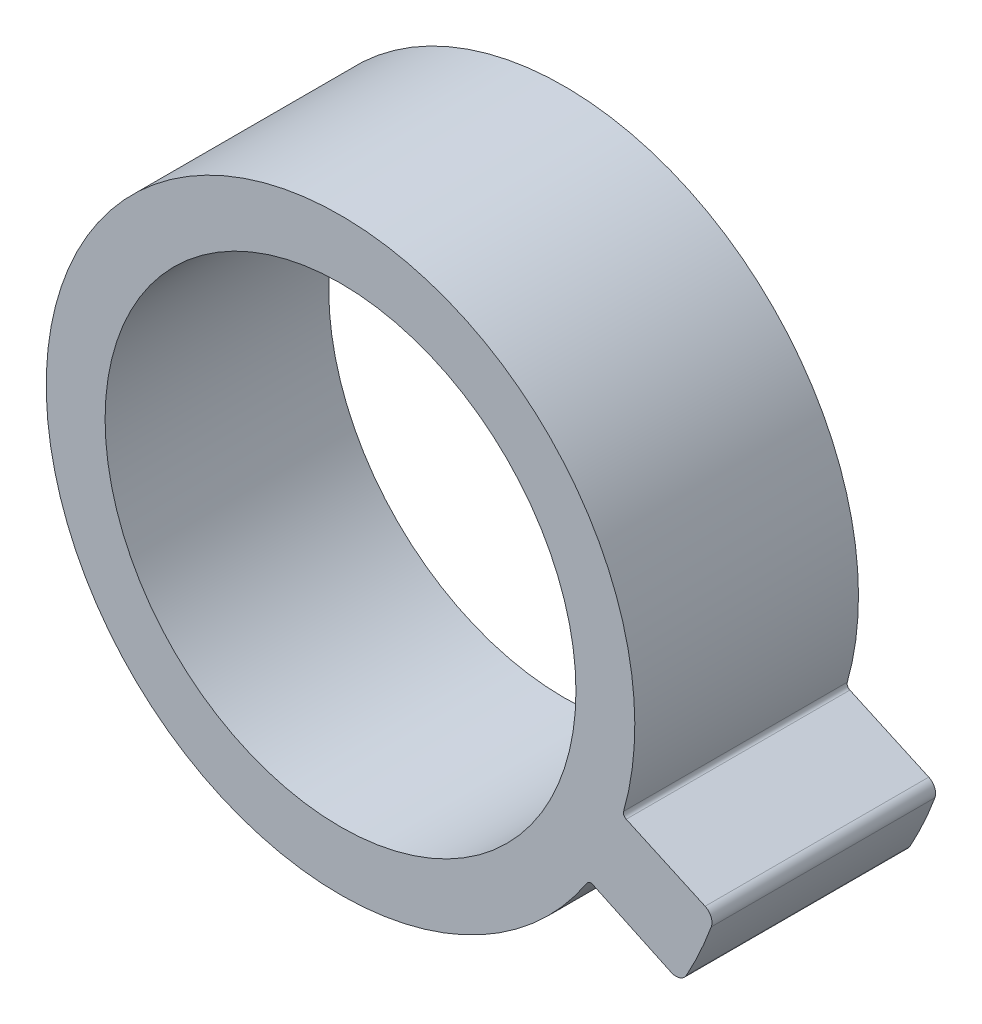
ISO-10303-21;
HEADER;
FILE_DESCRIPTION(('STEP AP214'),'2;1');
FILE_NAME('part.step','',(''),(''),'','','');
FILE_SCHEMA(('AUTOMOTIVE_DESIGN { 1 0 10303 214 1 1 1 1 }'));
ENDSEC;
DATA;
#1=APPLICATION_CONTEXT('core data for automotive mechanical design processes');
#2=APPLICATION_PROTOCOL_DEFINITION('international standard','automotive_design',2000,#1);
#3=PRODUCT_CONTEXT('',#1,'mechanical');
#4=PRODUCT('Part','Part','',(#3));
#5=PRODUCT_RELATED_PRODUCT_CATEGORY('part','',(#4));
#6=PRODUCT_DEFINITION_FORMATION('','',#4);
#7=PRODUCT_DEFINITION_CONTEXT('part definition',#1,'design');
#8=PRODUCT_DEFINITION('design','',#6,#7);
#9=PRODUCT_DEFINITION_SHAPE('','',#8);
#10=(LENGTH_UNIT() NAMED_UNIT(*) SI_UNIT(.MILLI.,.METRE.));
#11=(NAMED_UNIT(*) PLANE_ANGLE_UNIT() SI_UNIT($,.RADIAN.));
#12=(NAMED_UNIT(*) SI_UNIT($,.STERADIAN.) SOLID_ANGLE_UNIT());
#13=UNCERTAINTY_MEASURE_WITH_UNIT(LENGTH_MEASURE(1.E-05),#10,'distance_accuracy_value','');
#14=(GEOMETRIC_REPRESENTATION_CONTEXT(3) GLOBAL_UNCERTAINTY_ASSIGNED_CONTEXT((#13)) GLOBAL_UNIT_ASSIGNED_CONTEXT((#10,
#11,#12)) REPRESENTATION_CONTEXT('',''));
#15=CARTESIAN_POINT('',(0.,0.,0.));
#16=DIRECTION('',(0.,0.,1.));
#17=DIRECTION('',(1.,0.,0.));
#18=AXIS2_PLACEMENT_3D('',#15,#16,#17);
#19=CARTESIAN_POINT('',(15.2779729773756,-5.63171072795015,9.5));
#20=DIRECTION('',(0.,0.,1.));
#21=DIRECTION('',(1.,0.,0.));
#22=AXIS2_PLACEMENT_3D('',#19,#20,#21);
#23=PLANE('',#22);
#24=CARTESIAN_POINT('',(15.2779729773756,-5.63171072795015,9.5));
#25=DIRECTION('',(0.,0.,1.));
#26=DIRECTION('',(1.,0.,0.));
#27=AXIS2_PLACEMENT_3D('',#24,#25,#26);
#28=CIRCLE('',#27,0.499999999999998);
#29=CARTESIAN_POINT('',(15.747114806579,-5.80464407953859,9.5));
#30=VERTEX_POINT('',#29);
#31=CARTESIAN_POINT('',(15.4851855949086,-5.17666904729318,9.5));
#32=VERTEX_POINT('',#31);
#33=EDGE_CURVE('E145',#30,#32,#28,.T.);
#34=ORIENTED_EDGE('',*,*,#33,.T.);
#35=DIRECTION('',(-0.91008336131393,0.414425235066037,0.));
#36=VECTOR('',#35,1.);
#37=CARTESIAN_POINT('',(15.4851855949086,-5.17666904729318,9.5));
#38=LINE('',#37,#36);
#39=CARTESIAN_POINT('',(12.1342315429715,-3.65074298414162,9.5));
#40=VERTEX_POINT('',#39);
#41=EDGE_CURVE('E93',#32,#40,#38,.T.);
#42=ORIENTED_EDGE('',*,*,#41,.T.);
#43=CARTESIAN_POINT('',(12.2171165899847,-3.46872631187883,9.5));
#44=DIRECTION('',(0.,0.,-1.));
#45=DIRECTION('',(-1.,0.,0.));
#46=AXIS2_PLACEMENT_3D('',#43,#44,#45);
#47=CIRCLE('',#46,0.200000000000001);
#48=CARTESIAN_POINT('',(12.0247210531345,-3.41410070066815,9.5));
#49=VERTEX_POINT('',#48);
#50=EDGE_CURVE('E160',#40,#49,#47,.T.);
#51=ORIENTED_EDGE('',*,*,#50,.T.);
#52=CARTESIAN_POINT('',(0.,0.,9.5));
#53=DIRECTION('',(0.,0.,1.));
#54=DIRECTION('',(1.,0.,0.));
#55=AXIS2_PLACEMENT_3D('',#52,#53,#54);
#56=CIRCLE('',#55,12.5);
#57=CARTESIAN_POINT('',(10.4644302610838,-6.837082660822,9.5));
#58=VERTEX_POINT('',#57);
#59=EDGE_CURVE('E173',#49,#58,#56,.T.);
#60=ORIENTED_EDGE('',*,*,#59,.T.);
#61=CARTESIAN_POINT('',(10.6318611452612,-6.94647598339515,9.5));
#62=DIRECTION('',(0.,0.,-1.));
#63=DIRECTION('',(1.,0.,0.));
#64=AXIS2_PLACEMENT_3D('',#61,#62,#63);
#65=CIRCLE('',#64,0.2);
#66=CARTESIAN_POINT('',(10.7168303378893,-6.76542285223159,9.5));
#67=VERTEX_POINT('',#66);
#68=EDGE_CURVE('E112',#58,#67,#65,.T.);
#69=ORIENTED_EDGE('',*,*,#68,.T.);
#70=DIRECTION('',(0.905265655817804,-0.424845963140479,0.));
#71=VECTOR('',#70,1.);
#72=CARTESIAN_POINT('',(14.04074762561,-8.32535482626113,9.5));
#73=LINE('',#72,#71);
#74=CARTESIAN_POINT('',(14.04074762561,-8.32535482626113,9.5));
#75=VERTEX_POINT('',#74);
#76=EDGE_CURVE('E106',#67,#75,#73,.T.);
#77=ORIENTED_EDGE('',*,*,#76,.T.);
#78=CARTESIAN_POINT('',(14.2531706071803,-7.87272199835223,9.5));
#79=DIRECTION('',(0.,0.,1.));
#80=DIRECTION('',(1.,0.,0.));
#81=AXIS2_PLACEMENT_3D('',#78,#79,#80);
#82=CIRCLE('',#81,0.499999999999995);
#83=CARTESIAN_POINT('',(14.6908437553462,-8.11447024627666,9.5));
#84=VERTEX_POINT('',#83);
#85=EDGE_CURVE('E110',#75,#84,#82,.T.);
#86=ORIENTED_EDGE('',*,*,#85,.T.);
#87=CARTESIAN_POINT('',(0.,0.,9.5));
#88=DIRECTION('',(0.,0.,1.));
#89=DIRECTION('',(-1.,0.,0.));
#90=AXIS2_PLACEMENT_3D('',#87,#88,#89);
#91=CIRCLE('',#90,16.7828936009766);
#92=EDGE_CURVE('E50',#84,#30,#91,.T.);
#93=ORIENTED_EDGE('',*,*,#92,.T.);
#94=EDGE_LOOP('',(#34,#42,#51,#60,#69,#77,#86,#93));
#95=FACE_BOUND('',#94,.T.);
#96=CARTESIAN_POINT('',(0.,0.,9.5));
#97=DIRECTION('',(0.,0.,1.));
#98=DIRECTION('',(1.,0.,0.));
#99=AXIS2_PLACEMENT_3D('',#96,#97,#98);
#100=CIRCLE('',#99,10.);
#101=CARTESIAN_POINT('',(10.,0.,9.5));
#102=VERTEX_POINT('',#101);
#103=EDGE_CURVE('E134',#102,#102,#100,.T.);
#104=ORIENTED_EDGE('',*,*,#103,.F.);
#105=EDGE_LOOP('',(#104));
#106=FACE_BOUND('',#105,.T.);
#107=ADVANCED_FACE('F33',(#95,#106),#23,.T.);
#108=CARTESIAN_POINT('',(15.2779729773756,-5.63171072795015,0.));
#109=DIRECTION('',(0.,0.,1.));
#110=DIRECTION('',(1.,0.,0.));
#111=AXIS2_PLACEMENT_3D('',#108,#109,#110);
#112=PLANE('',#111);
#113=CARTESIAN_POINT('',(15.2779729773756,-5.63171072795015,0.));
#114=DIRECTION('',(0.,0.,1.));
#115=DIRECTION('',(1.,0.,0.));
#116=AXIS2_PLACEMENT_3D('',#113,#114,#115);
#117=CIRCLE('',#116,0.499999999999998);
#118=CARTESIAN_POINT('',(15.747114806579,-5.80464407953859,0.));
#119=VERTEX_POINT('',#118);
#120=CARTESIAN_POINT('',(15.4851855949086,-5.17666904729318,0.));
#121=VERTEX_POINT('',#120);
#122=EDGE_CURVE('E130',#119,#121,#117,.T.);
#123=ORIENTED_EDGE('',*,*,#122,.F.);
#124=CARTESIAN_POINT('',(0.,0.,0.));
#125=DIRECTION('',(0.,0.,1.));
#126=DIRECTION('',(-1.,0.,0.));
#127=AXIS2_PLACEMENT_3D('',#124,#125,#126);
#128=CIRCLE('',#127,16.7828936009766);
#129=CARTESIAN_POINT('',(14.6908437553462,-8.11447024627666,0.));
#130=VERTEX_POINT('',#129);
#131=EDGE_CURVE('E85',#130,#119,#128,.T.);
#132=ORIENTED_EDGE('',*,*,#131,.F.);
#133=CARTESIAN_POINT('',(14.2531706071803,-7.87272199835223,0.));
#134=DIRECTION('',(0.,0.,1.));
#135=DIRECTION('',(1.,0.,0.));
#136=AXIS2_PLACEMENT_3D('',#133,#134,#135);
#137=CIRCLE('',#136,0.499999999999995);
#138=CARTESIAN_POINT('',(14.04074762561,-8.32535482626113,0.));
#139=VERTEX_POINT('',#138);
#140=EDGE_CURVE('E79',#139,#130,#137,.T.);
#141=ORIENTED_EDGE('',*,*,#140,.F.);
#142=DIRECTION('',(0.905265655817804,-0.424845963140479,0.));
#143=VECTOR('',#142,1.);
#144=CARTESIAN_POINT('',(14.04074762561,-8.32535482626113,0.));
#145=LINE('',#144,#143);
#146=CARTESIAN_POINT('',(10.7168303378893,-6.76542285223159,0.));
#147=VERTEX_POINT('',#146);
#148=EDGE_CURVE('E120',#147,#139,#145,.T.);
#149=ORIENTED_EDGE('',*,*,#148,.F.);
#150=CARTESIAN_POINT('',(10.6318611452612,-6.94647598339515,0.));
#151=DIRECTION('',(0.,0.,-1.));
#152=DIRECTION('',(1.,0.,0.));
#153=AXIS2_PLACEMENT_3D('',#150,#151,#152);
#154=CIRCLE('',#153,0.2);
#155=CARTESIAN_POINT('',(10.4644302610838,-6.837082660822,0.));
#156=VERTEX_POINT('',#155);
#157=EDGE_CURVE('E140',#156,#147,#154,.T.);
#158=ORIENTED_EDGE('',*,*,#157,.F.);
#159=CARTESIAN_POINT('',(0.,0.,0.));
#160=DIRECTION('',(0.,0.,1.));
#161=DIRECTION('',(1.,0.,0.));
#162=AXIS2_PLACEMENT_3D('',#159,#160,#161);
#163=CIRCLE('',#162,12.5);
#164=CARTESIAN_POINT('',(12.0247210531345,-3.41410070066815,0.));
#165=VERTEX_POINT('',#164);
#166=EDGE_CURVE('E138',#165,#156,#163,.T.);
#167=ORIENTED_EDGE('',*,*,#166,.F.);
#168=CARTESIAN_POINT('',(12.2171165899847,-3.46872631187883,0.));
#169=DIRECTION('',(0.,0.,-1.));
#170=DIRECTION('',(-1.,0.,0.));
#171=AXIS2_PLACEMENT_3D('',#168,#169,#170);
#172=CIRCLE('',#171,0.200000000000001);
#173=CARTESIAN_POINT('',(12.1342315429715,-3.65074298414162,0.));
#174=VERTEX_POINT('',#173);
#175=EDGE_CURVE('E136',#174,#165,#172,.T.);
#176=ORIENTED_EDGE('',*,*,#175,.F.);
#177=DIRECTION('',(-0.91008336131393,0.414425235066037,0.));
#178=VECTOR('',#177,1.);
#179=CARTESIAN_POINT('',(15.4851855949086,-5.17666904729318,0.));
#180=LINE('',#179,#178);
#181=EDGE_CURVE('E133',#121,#174,#180,.T.);
#182=ORIENTED_EDGE('',*,*,#181,.F.);
#183=EDGE_LOOP('',(#123,#132,#141,#149,#158,#167,#176,#182));
#184=FACE_BOUND('',#183,.T.);
#185=CARTESIAN_POINT('',(0.,0.,0.));
#186=DIRECTION('',(0.,0.,1.));
#187=DIRECTION('',(1.,0.,0.));
#188=AXIS2_PLACEMENT_3D('',#185,#186,#187);
#189=CIRCLE('',#188,10.);
#190=CARTESIAN_POINT('',(10.,0.,0.));
#191=VERTEX_POINT('',#190);
#192=EDGE_CURVE('E179',#191,#191,#189,.T.);
#193=ORIENTED_EDGE('',*,*,#192,.T.);
#194=EDGE_LOOP('',(#193));
#195=FACE_BOUND('',#194,.T.);
#196=ADVANCED_FACE('F164',(#184,#195),#112,.F.);
#197=CARTESIAN_POINT('',(15.2779729773756,-5.63171072795015,9.5));
#198=DIRECTION('',(0.,0.,-1.));
#199=DIRECTION('',(-1.,0.,0.));
#200=AXIS2_PLACEMENT_3D('',#197,#198,#199);
#201=CYLINDRICAL_SURFACE('',#200,0.499999999999998);
#202=ORIENTED_EDGE('',*,*,#122,.T.);
#203=DIRECTION('',(0.,0.,-1.));
#204=VECTOR('',#203,1.);
#205=CARTESIAN_POINT('',(15.4851855949086,-5.17666904729318,9.5));
#206=LINE('',#205,#204);
#207=EDGE_CURVE('E11',#32,#121,#206,.T.);
#208=ORIENTED_EDGE('',*,*,#207,.F.);
#209=ORIENTED_EDGE('',*,*,#33,.F.);
#210=DIRECTION('',(0.,0.,-1.));
#211=VECTOR('',#210,1.);
#212=CARTESIAN_POINT('',(15.747114806579,-5.80464407953859,9.5));
#213=LINE('',#212,#211);
#214=EDGE_CURVE('E126',#30,#119,#213,.T.);
#215=ORIENTED_EDGE('',*,*,#214,.T.);
#216=EDGE_LOOP('',(#202,#208,#209,#215));
#217=FACE_BOUND('',#216,.T.);
#218=ADVANCED_FACE('F35',(#217),#201,.T.);
#219=CARTESIAN_POINT('',(15.4851855949086,-5.17666904729318,9.5));
#220=DIRECTION('',(-0.414425235066037,-0.910083361313929,0.));
#221=DIRECTION('',(0.910083361313929,-0.414425235066037,0.));
#222=AXIS2_PLACEMENT_3D('',#219,#220,#221);
#223=PLANE('',#222);
#224=ORIENTED_EDGE('',*,*,#181,.T.);
#225=DIRECTION('',(0.,0.,-1.));
#226=VECTOR('',#225,1.);
#227=CARTESIAN_POINT('',(12.1342315429715,-3.65074298414162,9.5));
#228=LINE('',#227,#226);
#229=EDGE_CURVE('E42',#40,#174,#228,.T.);
#230=ORIENTED_EDGE('',*,*,#229,.F.);
#231=ORIENTED_EDGE('',*,*,#41,.F.);
#232=ORIENTED_EDGE('',*,*,#207,.T.);
#233=EDGE_LOOP('',(#224,#230,#231,#232));
#234=FACE_BOUND('',#233,.T.);
#235=ADVANCED_FACE('F207',(#234),#223,.F.);
#236=CARTESIAN_POINT('',(12.2171165899847,-3.46872631187883,9.5));
#237=DIRECTION('',(0.,0.,-1.));
#238=DIRECTION('',(-1.,0.,0.));
#239=AXIS2_PLACEMENT_3D('',#236,#237,#238);
#240=CYLINDRICAL_SURFACE('',#239,0.200000000000001);
#241=ORIENTED_EDGE('',*,*,#175,.T.);
#242=DIRECTION('',(0.,0.,-1.));
#243=VECTOR('',#242,1.);
#244=CARTESIAN_POINT('',(12.0247210531345,-3.41410070066815,9.5));
#245=LINE('',#244,#243);
#246=EDGE_CURVE('E152',#49,#165,#245,.T.);
#247=ORIENTED_EDGE('',*,*,#246,.F.);
#248=ORIENTED_EDGE('',*,*,#50,.F.);
#249=ORIENTED_EDGE('',*,*,#229,.T.);
#250=EDGE_LOOP('',(#241,#247,#248,#249));
#251=FACE_BOUND('',#250,.T.);
#252=ADVANCED_FACE('F158',(#251),#240,.F.);
#253=CARTESIAN_POINT('',(0.,0.,9.5));
#254=DIRECTION('',(0.,0.,-1.));
#255=DIRECTION('',(-1.,0.,0.));
#256=AXIS2_PLACEMENT_3D('',#253,#254,#255);
#257=CYLINDRICAL_SURFACE('',#256,12.5);
#258=ORIENTED_EDGE('',*,*,#166,.T.);
#259=DIRECTION('',(0.,0.,-1.));
#260=VECTOR('',#259,1.);
#261=CARTESIAN_POINT('',(10.4644302610838,-6.837082660822,9.5));
#262=LINE('',#261,#260);
#263=EDGE_CURVE('E149',#58,#156,#262,.T.);
#264=ORIENTED_EDGE('',*,*,#263,.F.);
#265=ORIENTED_EDGE('',*,*,#59,.F.);
#266=ORIENTED_EDGE('',*,*,#246,.T.);
#267=EDGE_LOOP('',(#258,#264,#265,#266));
#268=FACE_BOUND('',#267,.T.);
#269=ADVANCED_FACE('F169',(#268),#257,.T.);
#270=CARTESIAN_POINT('',(10.6318611452612,-6.94647598339515,9.5));
#271=DIRECTION('',(0.,0.,-1.));
#272=DIRECTION('',(-1.,0.,0.));
#273=AXIS2_PLACEMENT_3D('',#270,#271,#272);
#274=CYLINDRICAL_SURFACE('',#273,0.2);
#275=ORIENTED_EDGE('',*,*,#157,.T.);
#276=DIRECTION('',(0.,0.,-1.));
#277=VECTOR('',#276,1.);
#278=CARTESIAN_POINT('',(10.7168303378893,-6.76542285223159,9.5));
#279=LINE('',#278,#277);
#280=EDGE_CURVE('E121',#67,#147,#279,.T.);
#281=ORIENTED_EDGE('',*,*,#280,.F.);
#282=ORIENTED_EDGE('',*,*,#68,.F.);
#283=ORIENTED_EDGE('',*,*,#263,.T.);
#284=EDGE_LOOP('',(#275,#281,#282,#283));
#285=FACE_BOUND('',#284,.T.);
#286=ADVANCED_FACE('F172',(#285),#274,.F.);
#287=CARTESIAN_POINT('',(14.04074762561,-8.32535482626113,9.5));
#288=DIRECTION('',(0.424845963140479,0.905265655817804,0.));
#289=DIRECTION('',(-0.905265655817804,0.424845963140479,0.));
#290=AXIS2_PLACEMENT_3D('',#287,#288,#289);
#291=PLANE('',#290);
#292=ORIENTED_EDGE('',*,*,#148,.T.);
#293=DIRECTION('',(0.,0.,-1.));
#294=VECTOR('',#293,1.);
#295=CARTESIAN_POINT('',(14.04074762561,-8.32535482626113,9.5));
#296=LINE('',#295,#294);
#297=EDGE_CURVE('E117',#75,#139,#296,.T.);
#298=ORIENTED_EDGE('',*,*,#297,.F.);
#299=ORIENTED_EDGE('',*,*,#76,.F.);
#300=ORIENTED_EDGE('',*,*,#280,.T.);
#301=EDGE_LOOP('',(#292,#298,#299,#300));
#302=FACE_BOUND('',#301,.T.);
#303=ADVANCED_FACE('F118',(#302),#291,.F.);
#304=CARTESIAN_POINT('',(14.2531706071803,-7.87272199835223,9.5));
#305=DIRECTION('',(0.,0.,-1.));
#306=DIRECTION('',(-1.,0.,0.));
#307=AXIS2_PLACEMENT_3D('',#304,#305,#306);
#308=CYLINDRICAL_SURFACE('',#307,0.499999999999995);
#309=ORIENTED_EDGE('',*,*,#140,.T.);
#310=DIRECTION('',(0.,0.,-1.));
#311=VECTOR('',#310,1.);
#312=CARTESIAN_POINT('',(14.6908437553462,-8.11447024627666,9.5));
#313=LINE('',#312,#311);
#314=EDGE_CURVE('E122',#84,#130,#313,.T.);
#315=ORIENTED_EDGE('',*,*,#314,.F.);
#316=ORIENTED_EDGE('',*,*,#85,.F.);
#317=ORIENTED_EDGE('',*,*,#297,.T.);
#318=EDGE_LOOP('',(#309,#315,#316,#317));
#319=FACE_BOUND('',#318,.T.);
#320=ADVANCED_FACE('F124',(#319),#308,.T.);
#321=CARTESIAN_POINT('',(0.,0.,9.5));
#322=DIRECTION('',(0.,0.,-1.));
#323=DIRECTION('',(-1.,0.,0.));
#324=AXIS2_PLACEMENT_3D('',#321,#322,#323);
#325=CYLINDRICAL_SURFACE('',#324,16.7828936009766);
#326=ORIENTED_EDGE('',*,*,#131,.T.);
#327=ORIENTED_EDGE('',*,*,#214,.F.);
#328=ORIENTED_EDGE('',*,*,#92,.F.);
#329=ORIENTED_EDGE('',*,*,#314,.T.);
#330=EDGE_LOOP('',(#326,#327,#328,#329));
#331=FACE_BOUND('',#330,.T.);
#332=ADVANCED_FACE('F195',(#331),#325,.T.);
#333=CARTESIAN_POINT('',(0.,0.,9.5));
#334=DIRECTION('',(0.,0.,-1.));
#335=DIRECTION('',(-1.,0.,0.));
#336=AXIS2_PLACEMENT_3D('',#333,#334,#335);
#337=CYLINDRICAL_SURFACE('',#336,10.);
#338=ORIENTED_EDGE('',*,*,#103,.T.);
#339=EDGE_LOOP('',(#338));
#340=FACE_BOUND('',#339,.T.);
#341=ORIENTED_EDGE('',*,*,#192,.F.);
#342=EDGE_LOOP('',(#341));
#343=FACE_BOUND('',#342,.T.);
#344=ADVANCED_FACE('F185',(#340,#343),#337,.F.);
#345=CLOSED_SHELL('',(#107,#196,#218,#235,#252,#269,#286,#303,#320,#332,#344));
#346=MANIFOLD_SOLID_BREP('B2',#345);
#347=ADVANCED_BREP_SHAPE_REPRESENTATION('',(#18,#346),#14);
#348=SHAPE_DEFINITION_REPRESENTATION(#9,#347);
ENDSEC;
END-ISO-10303-21;
